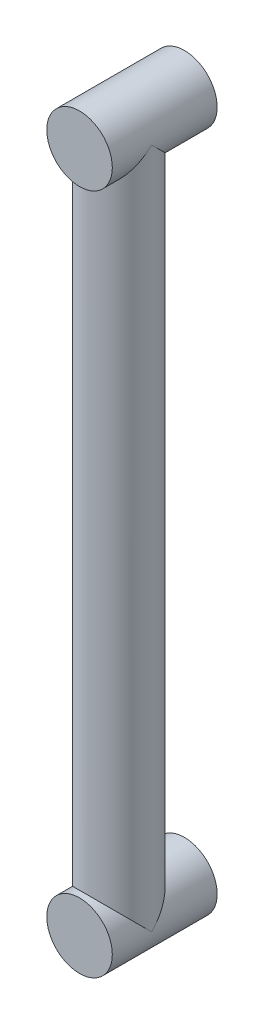
ISO-10303-21;
HEADER;
FILE_DESCRIPTION(('STEP AP214'),'2;1');
FILE_NAME('part.step','',(''),(''),'','','');
FILE_SCHEMA(('AUTOMOTIVE_DESIGN { 1 0 10303 214 1 1 1 1 }'));
ENDSEC;
DATA;
#1=APPLICATION_CONTEXT('core data for automotive mechanical design processes');
#2=APPLICATION_PROTOCOL_DEFINITION('international standard','automotive_design',2000,#1);
#3=PRODUCT_CONTEXT('',#1,'mechanical');
#4=PRODUCT('Part','Part','',(#3));
#5=PRODUCT_RELATED_PRODUCT_CATEGORY('part','',(#4));
#6=PRODUCT_DEFINITION_FORMATION('','',#4);
#7=PRODUCT_DEFINITION_CONTEXT('part definition',#1,'design');
#8=PRODUCT_DEFINITION('design','',#6,#7);
#9=PRODUCT_DEFINITION_SHAPE('','',#8);
#10=(LENGTH_UNIT() NAMED_UNIT(*) SI_UNIT(.MILLI.,.METRE.));
#11=(NAMED_UNIT(*) PLANE_ANGLE_UNIT() SI_UNIT($,.RADIAN.));
#12=(NAMED_UNIT(*) SI_UNIT($,.STERADIAN.) SOLID_ANGLE_UNIT());
#13=UNCERTAINTY_MEASURE_WITH_UNIT(LENGTH_MEASURE(1.E-05),#10,'distance_accuracy_value','');
#14=(GEOMETRIC_REPRESENTATION_CONTEXT(3) GLOBAL_UNCERTAINTY_ASSIGNED_CONTEXT((#13)) GLOBAL_UNIT_ASSIGNED_CONTEXT((#10,
#11,#12)) REPRESENTATION_CONTEXT('',''));
#15=CARTESIAN_POINT('',(0.,0.,0.));
#16=DIRECTION('',(0.,0.,1.));
#17=DIRECTION('',(1.,0.,0.));
#18=AXIS2_PLACEMENT_3D('',#15,#16,#17);
#19=CARTESIAN_POINT('',(0.,5200.,500.));
#20=DIRECTION('',(0.,-1.,0.));
#21=DIRECTION('',(0.,0.,-1.));
#22=AXIS2_PLACEMENT_3D('',#19,#20,#21);
#23=CYLINDRICAL_SURFACE('',#22,250.);
#24=CARTESIAN_POINT('',(0.,0.,500.));
#25=DIRECTION('',(0.,0.707106781186547,-0.707106781186547));
#26=DIRECTION('',(0.,-0.707106781186547,-0.707106781186547));
#27=AXIS2_PLACEMENT_3D('',#24,#25,#26);
#28=ELLIPSE('',#27,353.553390593274,250.);
#29=CARTESIAN_POINT('',(-250.,0.,500.));
#30=VERTEX_POINT('',#29);
#31=CARTESIAN_POINT('',(250.,0.,500.));
#32=VERTEX_POINT('',#31);
#33=EDGE_CURVE('E46',#30,#32,#28,.T.);
#34=ORIENTED_EDGE('',*,*,#33,.T.);
#35=CARTESIAN_POINT('',(0.,0.,500.));
#36=DIRECTION('',(0.,-0.707106781186547,-0.707106781186547));
#37=DIRECTION('',(0.,0.707106781186547,-0.707106781186547));
#38=AXIS2_PLACEMENT_3D('',#35,#36,#37);
#39=ELLIPSE('',#38,353.553390593274,250.);
#40=EDGE_CURVE('E11',#32,#30,#39,.F.);
#41=ORIENTED_EDGE('',*,*,#40,.T.);
#42=EDGE_LOOP('',(#34,#41));
#43=FACE_BOUND('',#42,.T.);
#44=CARTESIAN_POINT('',(0.,5200.,500.));
#45=DIRECTION('',(0.,-0.707106781186547,-0.707106781186547));
#46=DIRECTION('',(0.,-0.707106781186547,0.707106781186547));
#47=AXIS2_PLACEMENT_3D('',#44,#45,#46);
#48=ELLIPSE('',#47,353.553390593274,250.);
#49=CARTESIAN_POINT('',(-250.,5200.,500.));
#50=VERTEX_POINT('',#49);
#51=CARTESIAN_POINT('',(250.,5200.,500.));
#52=VERTEX_POINT('',#51);
#53=EDGE_CURVE('E62',#50,#52,#48,.F.);
#54=ORIENTED_EDGE('',*,*,#53,.F.);
#55=CARTESIAN_POINT('',(0.,5200.,500.));
#56=DIRECTION('',(0.,-0.707106781186547,0.707106781186547));
#57=DIRECTION('',(0.,-0.707106781186547,-0.707106781186547));
#58=AXIS2_PLACEMENT_3D('',#55,#56,#57);
#59=ELLIPSE('',#58,353.553390593274,250.);
#60=EDGE_CURVE('E52',#52,#50,#59,.F.);
#61=ORIENTED_EDGE('',*,*,#60,.F.);
#62=EDGE_LOOP('',(#54,#61));
#63=FACE_BOUND('',#62,.T.);
#64=ADVANCED_FACE('F38',(#43,#63),#23,.T.);
#65=CARTESIAN_POINT('',(0.,0.,800.));
#66=DIRECTION('',(0.,0.,-1.));
#67=DIRECTION('',(-1.,0.,0.));
#68=AXIS2_PLACEMENT_3D('',#65,#66,#67);
#69=CYLINDRICAL_SURFACE('',#68,250.);
#70=CARTESIAN_POINT('',(0.,0.,0.));
#71=DIRECTION('',(0.,0.,1.));
#72=DIRECTION('',(1.,0.,0.));
#73=AXIS2_PLACEMENT_3D('',#70,#71,#72);
#74=CIRCLE('',#73,250.);
#75=CARTESIAN_POINT('',(250.,0.,0.));
#76=VERTEX_POINT('',#75);
#77=EDGE_CURVE('E64',#76,#76,#74,.T.);
#78=ORIENTED_EDGE('',*,*,#77,.T.);
#79=EDGE_LOOP('',(#78));
#80=FACE_BOUND('',#79,.T.);
#81=CARTESIAN_POINT('',(0.,0.,800.));
#82=DIRECTION('',(0.,0.,1.));
#83=DIRECTION('',(1.,0.,0.));
#84=AXIS2_PLACEMENT_3D('',#81,#82,#83);
#85=CIRCLE('',#84,250.);
#86=CARTESIAN_POINT('',(250.,0.,800.));
#87=VERTEX_POINT('',#86);
#88=EDGE_CURVE('E74',#87,#87,#85,.T.);
#89=ORIENTED_EDGE('',*,*,#88,.F.);
#90=EDGE_LOOP('',(#89));
#91=FACE_BOUND('',#90,.T.);
#92=ORIENTED_EDGE('',*,*,#40,.F.);
#93=ORIENTED_EDGE('',*,*,#33,.F.);
#94=EDGE_LOOP('',(#92,#93));
#95=FACE_BOUND('',#94,.T.);
#96=ADVANCED_FACE('F40',(#80,#91,#95),#69,.T.);
#97=CARTESIAN_POINT('',(0.,0.,800.));
#98=DIRECTION('',(0.,0.,1.));
#99=DIRECTION('',(1.,0.,0.));
#100=AXIS2_PLACEMENT_3D('',#97,#98,#99);
#101=PLANE('',#100);
#102=ORIENTED_EDGE('',*,*,#88,.T.);
#103=EDGE_LOOP('',(#102));
#104=FACE_BOUND('',#103,.T.);
#105=ADVANCED_FACE('F80',(#104),#101,.T.);
#106=CARTESIAN_POINT('',(0.,0.,0.));
#107=DIRECTION('',(0.,0.,1.));
#108=DIRECTION('',(1.,0.,0.));
#109=AXIS2_PLACEMENT_3D('',#106,#107,#108);
#110=PLANE('',#109);
#111=ORIENTED_EDGE('',*,*,#77,.F.);
#112=EDGE_LOOP('',(#111));
#113=FACE_BOUND('',#112,.T.);
#114=ADVANCED_FACE('F86',(#113),#110,.F.);
#115=CARTESIAN_POINT('',(0.,5200.,800.));
#116=DIRECTION('',(0.,0.,-1.));
#117=DIRECTION('',(-1.,0.,0.));
#118=AXIS2_PLACEMENT_3D('',#115,#116,#117);
#119=CYLINDRICAL_SURFACE('',#118,250.);
#120=CARTESIAN_POINT('',(0.,5200.,800.));
#121=DIRECTION('',(0.,0.,1.));
#122=DIRECTION('',(1.,0.,0.));
#123=AXIS2_PLACEMENT_3D('',#120,#121,#122);
#124=CIRCLE('',#123,250.);
#125=CARTESIAN_POINT('',(250.,5200.,800.));
#126=VERTEX_POINT('',#125);
#127=EDGE_CURVE('E67',#126,#126,#124,.T.);
#128=ORIENTED_EDGE('',*,*,#127,.F.);
#129=EDGE_LOOP('',(#128));
#130=FACE_BOUND('',#129,.T.);
#131=CARTESIAN_POINT('',(0.,5200.,0.));
#132=DIRECTION('',(0.,0.,1.));
#133=DIRECTION('',(1.,0.,0.));
#134=AXIS2_PLACEMENT_3D('',#131,#132,#133);
#135=CIRCLE('',#134,250.);
#136=CARTESIAN_POINT('',(250.,5200.,0.));
#137=VERTEX_POINT('',#136);
#138=EDGE_CURVE('E70',#137,#137,#135,.T.);
#139=ORIENTED_EDGE('',*,*,#138,.T.);
#140=EDGE_LOOP('',(#139));
#141=FACE_BOUND('',#140,.T.);
#142=ORIENTED_EDGE('',*,*,#60,.T.);
#143=ORIENTED_EDGE('',*,*,#53,.T.);
#144=EDGE_LOOP('',(#142,#143));
#145=FACE_BOUND('',#144,.T.);
#146=ADVANCED_FACE('F66',(#130,#141,#145),#119,.T.);
#147=CARTESIAN_POINT('',(0.,5200.,800.));
#148=DIRECTION('',(0.,0.,1.));
#149=DIRECTION('',(1.,0.,0.));
#150=AXIS2_PLACEMENT_3D('',#147,#148,#149);
#151=PLANE('',#150);
#152=ORIENTED_EDGE('',*,*,#127,.T.);
#153=EDGE_LOOP('',(#152));
#154=FACE_BOUND('',#153,.T.);
#155=ADVANCED_FACE('F98',(#154),#151,.T.);
#156=CARTESIAN_POINT('',(0.,5200.,0.));
#157=DIRECTION('',(0.,0.,1.));
#158=DIRECTION('',(1.,0.,0.));
#159=AXIS2_PLACEMENT_3D('',#156,#157,#158);
#160=PLANE('',#159);
#161=ORIENTED_EDGE('',*,*,#138,.F.);
#162=EDGE_LOOP('',(#161));
#163=FACE_BOUND('',#162,.T.);
#164=ADVANCED_FACE('F102',(#163),#160,.F.);
#165=CLOSED_SHELL('',(#64,#96,#105,#114,#146,#155,#164));
#166=MANIFOLD_SOLID_BREP('B2',#165);
#167=ADVANCED_BREP_SHAPE_REPRESENTATION('',(#18,#166),#14);
#168=SHAPE_DEFINITION_REPRESENTATION(#9,#167);
ENDSEC;
END-ISO-10303-21;
